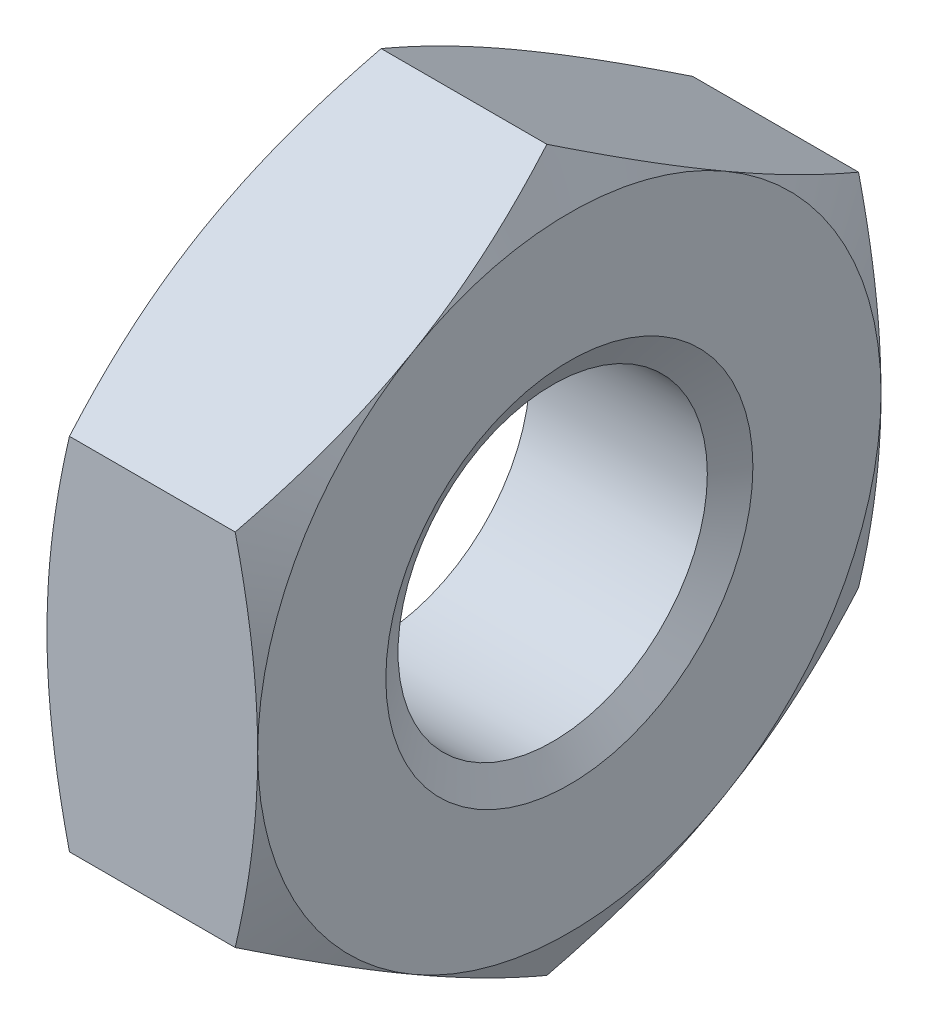
ISO-10303-21;
HEADER;
FILE_DESCRIPTION(('STEP AP214'),'2;1');
FILE_NAME('part.step','',(''),(''),'','','');
FILE_SCHEMA(('AUTOMOTIVE_DESIGN { 1 0 10303 214 1 1 1 1 }'));
ENDSEC;
DATA;
#1=APPLICATION_CONTEXT('core data for automotive mechanical design processes');
#2=APPLICATION_PROTOCOL_DEFINITION('international standard','automotive_design',2000,#1);
#3=PRODUCT_CONTEXT('',#1,'mechanical');
#4=PRODUCT('Part','Part','',(#3));
#5=PRODUCT_RELATED_PRODUCT_CATEGORY('part','',(#4));
#6=PRODUCT_DEFINITION_FORMATION('','',#4);
#7=PRODUCT_DEFINITION_CONTEXT('part definition',#1,'design');
#8=PRODUCT_DEFINITION('design','',#6,#7);
#9=PRODUCT_DEFINITION_SHAPE('','',#8);
#10=(LENGTH_UNIT() NAMED_UNIT(*) SI_UNIT(.MILLI.,.METRE.));
#11=(NAMED_UNIT(*) PLANE_ANGLE_UNIT() SI_UNIT($,.RADIAN.));
#12=(NAMED_UNIT(*) SI_UNIT($,.STERADIAN.) SOLID_ANGLE_UNIT());
#13=UNCERTAINTY_MEASURE_WITH_UNIT(LENGTH_MEASURE(1.E-05),#10,'distance_accuracy_value','');
#14=(GEOMETRIC_REPRESENTATION_CONTEXT(3) GLOBAL_UNCERTAINTY_ASSIGNED_CONTEXT((#13)) GLOBAL_UNIT_ASSIGNED_CONTEXT((#10,
#11,#12)) REPRESENTATION_CONTEXT('',''));
#15=CARTESIAN_POINT('',(0.,0.,0.));
#16=DIRECTION('',(0.,0.,1.));
#17=DIRECTION('',(1.,0.,0.));
#18=AXIS2_PLACEMENT_3D('',#15,#16,#17);
#19=CARTESIAN_POINT('',(0.,-7.78695402066813,-13.4874));
#20=DIRECTION('',(0.,-0.866025403784438,-0.5));
#21=DIRECTION('',(0.,0.5,-0.866025403784438));
#22=AXIS2_PLACEMENT_3D('',#19,#20,#21);
#23=PLANE('',#22);
#24=CARTESIAN_POINT('',(0.,-11.6804310310022,-6.7437));
#25=CARTESIAN_POINT('',(0.,-9.87346206200447,-9.87346206200447));
#26=CARTESIAN_POINT('',(0.972954678477099,-7.78695402066815,-13.4874));
#27=(BOUNDED_CURVE() B_SPLINE_CURVE(2,(#24,#25,#26),.UNSPECIFIED.,.F.,
.F.) B_SPLINE_CURVE_WITH_KNOTS((3,3),(0.786078902186761,1.57215780437352),
.UNSPECIFIED.) CURVE() GEOMETRIC_REPRESENTATION_ITEM() RATIONAL_B_SPLINE_CURVE((1.,
1.03795484930203,1.)) REPRESENTATION_ITEM(''));
#28=CARTESIAN_POINT('',(0.,-11.6804310310022,-6.7437));
#29=VERTEX_POINT('',#28);
#30=CARTESIAN_POINT('',(0.972954678477099,-7.7869540206681,-13.4874));
#31=VERTEX_POINT('',#30);
#32=EDGE_CURVE('E248',#29,#31,#27,.T.);
#33=ORIENTED_EDGE('',*,*,#32,.T.);
#34=DIRECTION('',(1.,0.,0.));
#35=VECTOR('',#34,1.);
#36=CARTESIAN_POINT('',(0.972954678477099,-7.78695402066813,-13.4874));
#37=LINE('',#36,#35);
#38=CARTESIAN_POINT('',(8.1456453215229,-7.7869540206681,-13.4874));
#39=VERTEX_POINT('',#38);
#40=EDGE_CURVE('E11',#31,#39,#37,.T.);
#41=ORIENTED_EDGE('',*,*,#40,.T.);
#42=CARTESIAN_POINT('',(8.1456453215229,-7.78695402066815,-13.4874));
#43=CARTESIAN_POINT('',(9.11859999999999,-9.87346206200445,-9.87346206200451));
#44=CARTESIAN_POINT('',(9.1186,-11.6804310310022,-6.7437));
#45=(BOUNDED_CURVE() B_SPLINE_CURVE(2,(#42,#43,#44),.UNSPECIFIED.,.F.,
.F.) B_SPLINE_CURVE_WITH_KNOTS((3,3),(0.,0.786078902186761),
.UNSPECIFIED.) CURVE() GEOMETRIC_REPRESENTATION_ITEM() RATIONAL_B_SPLINE_CURVE((1.,
1.03795484930204,1.)) REPRESENTATION_ITEM(''));
#46=CARTESIAN_POINT('',(9.1186,-11.6804310310022,-6.7437));
#47=VERTEX_POINT('',#46);
#48=EDGE_CURVE('E154',#39,#47,#45,.T.);
#49=ORIENTED_EDGE('',*,*,#48,.T.);
#50=CARTESIAN_POINT('',(9.1186,-11.6804310310022,-6.7437));
#51=CARTESIAN_POINT('',(9.1186,-13.4874,-3.61393793799552));
#52=CARTESIAN_POINT('',(8.1456453215229,-15.5739080413364,0.));
#53=(BOUNDED_CURVE() B_SPLINE_CURVE(2,(#50,#51,#52),.UNSPECIFIED.,.F.,
.F.) B_SPLINE_CURVE_WITH_KNOTS((3,3),(0.786078902186761,1.57215780437352),
.UNSPECIFIED.) CURVE() GEOMETRIC_REPRESENTATION_ITEM() RATIONAL_B_SPLINE_CURVE((1.,
1.03795484930204,1.)) REPRESENTATION_ITEM(''));
#54=CARTESIAN_POINT('',(8.1456453215229,-15.5739080413364,0.));
#55=VERTEX_POINT('',#54);
#56=EDGE_CURVE('E157',#47,#55,#53,.T.);
#57=ORIENTED_EDGE('',*,*,#56,.T.);
#58=DIRECTION('',(1.,0.,0.));
#59=VECTOR('',#58,1.);
#60=CARTESIAN_POINT('',(0.972954678477099,-15.5739080413364,0.));
#61=LINE('',#60,#59);
#62=CARTESIAN_POINT('',(0.972954678477099,-15.5739080413364,0.));
#63=VERTEX_POINT('',#62);
#64=EDGE_CURVE('E227',#63,#55,#61,.T.);
#65=ORIENTED_EDGE('',*,*,#64,.F.);
#66=CARTESIAN_POINT('',(0.972954678477099,-15.5739080413364,0.));
#67=CARTESIAN_POINT('',(0.,-13.4874,-3.61393793799552));
#68=CARTESIAN_POINT('',(0.,-11.6804310310022,-6.7437));
#69=(BOUNDED_CURVE() B_SPLINE_CURVE(2,(#66,#67,#68),.UNSPECIFIED.,.F.,
.F.) B_SPLINE_CURVE_WITH_KNOTS((3,3),(0.,0.786078902186761),
.UNSPECIFIED.) CURVE() GEOMETRIC_REPRESENTATION_ITEM() RATIONAL_B_SPLINE_CURVE((1.,
1.03795484930204,1.)) REPRESENTATION_ITEM(''));
#70=EDGE_CURVE('E233',#63,#29,#69,.T.);
#71=ORIENTED_EDGE('',*,*,#70,.T.);
#72=EDGE_LOOP('',(#33,#41,#49,#57,#65,#71));
#73=FACE_BOUND('',#72,.T.);
#74=ADVANCED_FACE('F16',(#73),#23,.T.);
#75=CARTESIAN_POINT('',(0.,7.78695402066818,-13.4874));
#76=DIRECTION('',(0.,0.,-1.));
#77=DIRECTION('',(0.,-1.,0.));
#78=AXIS2_PLACEMENT_3D('',#75,#76,#77);
#79=PLANE('',#78);
#80=CARTESIAN_POINT('',(0.,0.,-13.4874));
#81=CARTESIAN_POINT('',(0.,3.61393793799555,-13.4874));
#82=CARTESIAN_POINT('',(0.972954678477099,7.78695402066815,-13.4874));
#83=(BOUNDED_CURVE() B_SPLINE_CURVE(2,(#80,#81,#82),.UNSPECIFIED.,.F.,
.F.) B_SPLINE_CURVE_WITH_KNOTS((3,3),(0.786078902186757,1.57215780437351),
.UNSPECIFIED.) CURVE() GEOMETRIC_REPRESENTATION_ITEM() RATIONAL_B_SPLINE_CURVE((1.,
1.03795484930204,1.)) REPRESENTATION_ITEM(''));
#84=CARTESIAN_POINT('',(0.,0.,-13.4874));
#85=VERTEX_POINT('',#84);
#86=CARTESIAN_POINT('',(0.972954678477099,7.7869540206682,-13.4874));
#87=VERTEX_POINT('',#86);
#88=EDGE_CURVE('E225',#85,#87,#83,.T.);
#89=ORIENTED_EDGE('',*,*,#88,.T.);
#90=DIRECTION('',(1.,0.,0.));
#91=VECTOR('',#90,1.);
#92=CARTESIAN_POINT('',(0.972954678477099,7.78695402066818,-13.4874));
#93=LINE('',#92,#91);
#94=CARTESIAN_POINT('',(8.1456453215229,7.7869540206682,-13.4874));
#95=VERTEX_POINT('',#94);
#96=EDGE_CURVE('E27',#87,#95,#93,.T.);
#97=ORIENTED_EDGE('',*,*,#96,.T.);
#98=CARTESIAN_POINT('',(8.1456453215229,7.78695402066815,-13.4874));
#99=CARTESIAN_POINT('',(9.11860000000001,3.61393793799555,-13.4874));
#100=CARTESIAN_POINT('',(9.1186,0.,-13.4874));
#101=(BOUNDED_CURVE() B_SPLINE_CURVE(2,(#98,#99,#100),.UNSPECIFIED.,.F.,
.F.) B_SPLINE_CURVE_WITH_KNOTS((3,3),(0.,0.786078902186757),
.UNSPECIFIED.) CURVE() GEOMETRIC_REPRESENTATION_ITEM() RATIONAL_B_SPLINE_CURVE((1.,
1.03795484930203,1.)) REPRESENTATION_ITEM(''));
#102=CARTESIAN_POINT('',(9.1186,0.,-13.4874));
#103=VERTEX_POINT('',#102);
#104=EDGE_CURVE('E211',#95,#103,#101,.T.);
#105=ORIENTED_EDGE('',*,*,#104,.T.);
#106=CARTESIAN_POINT('',(9.1186,0.,-13.4874));
#107=CARTESIAN_POINT('',(9.11860000000001,-3.61393793799547,-13.4874));
#108=CARTESIAN_POINT('',(8.1456453215229,-7.7869540206681,-13.4874));
#109=(BOUNDED_CURVE() B_SPLINE_CURVE(2,(#106,#107,#108),.UNSPECIFIED.,.F.,
.F.) B_SPLINE_CURVE_WITH_KNOTS((3,3),(0.786078902186757,1.57215780437351),
.UNSPECIFIED.) CURVE() GEOMETRIC_REPRESENTATION_ITEM() RATIONAL_B_SPLINE_CURVE((1.,
1.03795484930204,1.)) REPRESENTATION_ITEM(''));
#110=EDGE_CURVE('E165',#103,#39,#109,.T.);
#111=ORIENTED_EDGE('',*,*,#110,.T.);
#112=ORIENTED_EDGE('',*,*,#40,.F.);
#113=CARTESIAN_POINT('',(0.972954678477125,-7.7869540206681,-13.4874));
#114=CARTESIAN_POINT('',(0.,-3.61393793799547,-13.4874));
#115=CARTESIAN_POINT('',(0.,0.,-13.4874));
#116=(BOUNDED_CURVE() B_SPLINE_CURVE(2,(#113,#114,#115),.UNSPECIFIED.,.F.,
.F.) B_SPLINE_CURVE_WITH_KNOTS((3,3),(0.,0.786078902186757),
.UNSPECIFIED.) CURVE() GEOMETRIC_REPRESENTATION_ITEM() RATIONAL_B_SPLINE_CURVE((1.,
1.03795484930204,1.)) REPRESENTATION_ITEM(''));
#117=EDGE_CURVE('E239',#31,#85,#116,.T.);
#118=ORIENTED_EDGE('',*,*,#117,.T.);
#119=EDGE_LOOP('',(#89,#97,#105,#111,#112,#118));
#120=FACE_BOUND('',#119,.T.);
#121=ADVANCED_FACE('F419',(#120),#79,.T.);
#122=CARTESIAN_POINT('',(0.,15.5739080413364,0.));
#123=DIRECTION('',(0.,0.866025403784439,-0.5));
#124=DIRECTION('',(-1.,0.,0.));
#125=AXIS2_PLACEMENT_3D('',#122,#123,#124);
#126=PLANE('',#125);
#127=CARTESIAN_POINT('',(0.,11.6804310310023,-6.7437));
#128=CARTESIAN_POINT('',(0.,13.4874,-3.61393793799553));
#129=CARTESIAN_POINT('',(0.972954678477125,15.5739080413364,0.));
#130=(BOUNDED_CURVE() B_SPLINE_CURVE(2,(#127,#128,#129),.UNSPECIFIED.,.F.,
.F.) B_SPLINE_CURVE_WITH_KNOTS((3,3),(0.786078902186758,1.57215780437351),
.UNSPECIFIED.) CURVE() GEOMETRIC_REPRESENTATION_ITEM() RATIONAL_B_SPLINE_CURVE((1.,
1.03795484930204,1.)) REPRESENTATION_ITEM(''));
#131=CARTESIAN_POINT('',(0.,11.6804310310023,-6.7437));
#132=VERTEX_POINT('',#131);
#133=CARTESIAN_POINT('',(0.972954678477099,15.5739080413364,0.));
#134=VERTEX_POINT('',#133);
#135=EDGE_CURVE('E298',#132,#134,#130,.T.);
#136=ORIENTED_EDGE('',*,*,#135,.T.);
#137=DIRECTION('',(1.,0.,0.));
#138=VECTOR('',#137,1.);
#139=CARTESIAN_POINT('',(0.972954678477099,15.5739080413364,0.));
#140=LINE('',#139,#138);
#141=CARTESIAN_POINT('',(8.1456453215229,15.5739080413364,0.));
#142=VERTEX_POINT('',#141);
#143=EDGE_CURVE('E20',#134,#142,#140,.T.);
#144=ORIENTED_EDGE('',*,*,#143,.T.);
#145=CARTESIAN_POINT('',(8.1456453215229,15.5739080413364,0.));
#146=CARTESIAN_POINT('',(9.11859999999999,13.4874,-3.61393793799552));
#147=CARTESIAN_POINT('',(9.1186,11.6804310310023,-6.7437));
#148=(BOUNDED_CURVE() B_SPLINE_CURVE(2,(#145,#146,#147),.UNSPECIFIED.,.F.,
.F.) B_SPLINE_CURVE_WITH_KNOTS((3,3),(0.,0.786078902186758),
.UNSPECIFIED.) CURVE() GEOMETRIC_REPRESENTATION_ITEM() RATIONAL_B_SPLINE_CURVE((1.,
1.03795484930205,1.)) REPRESENTATION_ITEM(''));
#149=CARTESIAN_POINT('',(9.1186,11.6804310310023,-6.7437));
#150=VERTEX_POINT('',#149);
#151=EDGE_CURVE('E287',#142,#150,#148,.T.);
#152=ORIENTED_EDGE('',*,*,#151,.T.);
#153=CARTESIAN_POINT('',(9.1186,11.6804310310023,-6.7437));
#154=CARTESIAN_POINT('',(9.1186,9.87346206200451,-9.87346206200445));
#155=CARTESIAN_POINT('',(8.1456453215229,7.7869540206682,-13.4874));
#156=(BOUNDED_CURVE() B_SPLINE_CURVE(2,(#153,#154,#155),.UNSPECIFIED.,.F.,
.F.) B_SPLINE_CURVE_WITH_KNOTS((3,3),(0.786078902186758,1.57215780437351),
.UNSPECIFIED.) CURVE() GEOMETRIC_REPRESENTATION_ITEM() RATIONAL_B_SPLINE_CURVE((1.,
1.03795484930204,1.)) REPRESENTATION_ITEM(''));
#157=EDGE_CURVE('E206',#150,#95,#156,.T.);
#158=ORIENTED_EDGE('',*,*,#157,.T.);
#159=ORIENTED_EDGE('',*,*,#96,.F.);
#160=CARTESIAN_POINT('',(0.972954678477125,7.7869540206682,-13.4874));
#161=CARTESIAN_POINT('',(0.,9.87346206200451,-9.87346206200449));
#162=CARTESIAN_POINT('',(0.,11.6804310310023,-6.7437));
#163=(BOUNDED_CURVE() B_SPLINE_CURVE(2,(#160,#161,#162),.UNSPECIFIED.,.F.,
.F.) B_SPLINE_CURVE_WITH_KNOTS((3,3),(0.,0.786078902186758),
.UNSPECIFIED.) CURVE() GEOMETRIC_REPRESENTATION_ITEM() RATIONAL_B_SPLINE_CURVE((1.,
1.03795484930204,1.)) REPRESENTATION_ITEM(''));
#164=EDGE_CURVE('E220',#87,#132,#163,.T.);
#165=ORIENTED_EDGE('',*,*,#164,.T.);
#166=EDGE_LOOP('',(#136,#144,#152,#158,#159,#165));
#167=FACE_BOUND('',#166,.T.);
#168=ADVANCED_FACE('F424',(#167),#126,.T.);
#169=CARTESIAN_POINT('',(0.,-15.5739080413364,0.));
#170=DIRECTION('',(0.,-0.866025403784439,0.5));
#171=DIRECTION('',(-1.,0.,0.));
#172=AXIS2_PLACEMENT_3D('',#169,#170,#171);
#173=PLANE('',#172);
#174=CARTESIAN_POINT('',(0.972954678477099,-7.78695402066815,13.4874));
#175=CARTESIAN_POINT('',(0.,-9.87346206200448,9.87346206200448));
#176=CARTESIAN_POINT('',(0.,-11.6804310310022,6.7437));
#177=(BOUNDED_CURVE() B_SPLINE_CURVE(2,(#174,#175,#176),.UNSPECIFIED.,.F.,
.F.) B_SPLINE_CURVE_WITH_KNOTS((3,3),(0.,0.78607890218676),
.UNSPECIFIED.) CURVE() GEOMETRIC_REPRESENTATION_ITEM() RATIONAL_B_SPLINE_CURVE((1.,
1.03795484930205,1.)) REPRESENTATION_ITEM(''));
#178=CARTESIAN_POINT('',(0.972954678477099,-7.78695402066818,13.4874));
#179=VERTEX_POINT('',#178);
#180=CARTESIAN_POINT('',(0.,-11.6804310310022,6.7437));
#181=VERTEX_POINT('',#180);
#182=EDGE_CURVE('E226',#179,#181,#177,.T.);
#183=ORIENTED_EDGE('',*,*,#182,.T.);
#184=CARTESIAN_POINT('',(0.,-11.6804310310022,6.7437));
#185=CARTESIAN_POINT('',(0.,-13.4874,3.61393793799552));
#186=CARTESIAN_POINT('',(0.972954678477099,-15.5739080413364,0.));
#187=(BOUNDED_CURVE() B_SPLINE_CURVE(2,(#184,#185,#186),.UNSPECIFIED.,.F.,
.F.) B_SPLINE_CURVE_WITH_KNOTS((3,3),(0.78607890218676,1.57215780437352),
.UNSPECIFIED.) CURVE() GEOMETRIC_REPRESENTATION_ITEM() RATIONAL_B_SPLINE_CURVE((1.,
1.03795484930204,1.)) REPRESENTATION_ITEM(''));
#188=EDGE_CURVE('E185',#181,#63,#187,.T.);
#189=ORIENTED_EDGE('',*,*,#188,.T.);
#190=ORIENTED_EDGE('',*,*,#64,.T.);
#191=CARTESIAN_POINT('',(8.1456453215229,-15.5739080413364,0.));
#192=CARTESIAN_POINT('',(9.11860000000001,-13.4874,3.61393793799552));
#193=CARTESIAN_POINT('',(9.1186,-11.6804310310022,6.7437));
#194=(BOUNDED_CURVE() B_SPLINE_CURVE(2,(#191,#192,#193),.UNSPECIFIED.,.F.,
.F.) B_SPLINE_CURVE_WITH_KNOTS((3,3),(0.,0.786078902186761),
.UNSPECIFIED.) CURVE() GEOMETRIC_REPRESENTATION_ITEM() RATIONAL_B_SPLINE_CURVE((1.,
1.03795484930203,1.)) REPRESENTATION_ITEM(''));
#195=CARTESIAN_POINT('',(9.1186,-11.6804310310022,6.7437));
#196=VERTEX_POINT('',#195);
#197=EDGE_CURVE('E173',#55,#196,#194,.T.);
#198=ORIENTED_EDGE('',*,*,#197,.T.);
#199=CARTESIAN_POINT('',(9.1186,-11.6804310310022,6.7437));
#200=CARTESIAN_POINT('',(9.1186,-9.87346206200449,9.87346206200449));
#201=CARTESIAN_POINT('',(8.1456453215229,-7.78695402066815,13.4874));
#202=(BOUNDED_CURVE() B_SPLINE_CURVE(2,(#199,#200,#201),.UNSPECIFIED.,.F.,
.F.) B_SPLINE_CURVE_WITH_KNOTS((3,3),(0.786078902186761,1.57215780437352),
.UNSPECIFIED.) CURVE() GEOMETRIC_REPRESENTATION_ITEM() RATIONAL_B_SPLINE_CURVE((1.,
1.03795484930204,1.)) REPRESENTATION_ITEM(''));
#203=CARTESIAN_POINT('',(8.1456453215229,-7.78695402066818,13.4874));
#204=VERTEX_POINT('',#203);
#205=EDGE_CURVE('E258',#196,#204,#202,.T.);
#206=ORIENTED_EDGE('',*,*,#205,.T.);
#207=DIRECTION('',(1.,0.,0.));
#208=VECTOR('',#207,1.);
#209=CARTESIAN_POINT('',(0.972954678477099,-7.78695402066815,13.4874));
#210=LINE('',#209,#208);
#211=EDGE_CURVE('E125',#179,#204,#210,.T.);
#212=ORIENTED_EDGE('',*,*,#211,.F.);
#213=EDGE_LOOP('',(#183,#189,#190,#198,#206,#212));
#214=FACE_BOUND('',#213,.T.);
#215=ADVANCED_FACE('F442',(#214),#173,.T.);
#216=CARTESIAN_POINT('',(0.,-7.78695402066815,13.4874));
#217=DIRECTION('',(0.,0.,1.));
#218=DIRECTION('',(1.,0.,0.));
#219=AXIS2_PLACEMENT_3D('',#216,#217,#218);
#220=PLANE('',#219);
#221=CARTESIAN_POINT('',(0.972954678477099,7.78695402066818,13.4874));
#222=CARTESIAN_POINT('',(0.,3.61393793799552,13.4874));
#223=CARTESIAN_POINT('',(0.,0.,13.4874));
#224=(BOUNDED_CURVE() B_SPLINE_CURVE(2,(#221,#222,#223),.UNSPECIFIED.,.F.,
.F.) B_SPLINE_CURVE_WITH_KNOTS((3,3),(0.,0.786078902186761),
.UNSPECIFIED.) CURVE() GEOMETRIC_REPRESENTATION_ITEM() RATIONAL_B_SPLINE_CURVE((1.,
1.03795484930205,1.)) REPRESENTATION_ITEM(''));
#225=CARTESIAN_POINT('',(0.972954678477099,7.78695402066818,13.4874));
#226=VERTEX_POINT('',#225);
#227=CARTESIAN_POINT('',(0.,0.,13.4874));
#228=VERTEX_POINT('',#227);
#229=EDGE_CURVE('E303',#226,#228,#224,.T.);
#230=ORIENTED_EDGE('',*,*,#229,.T.);
#231=CARTESIAN_POINT('',(0.,0.,13.4874));
#232=CARTESIAN_POINT('',(0.,-3.61393793799552,13.4874));
#233=CARTESIAN_POINT('',(0.972954678477099,-7.78695402066818,13.4874));
#234=(BOUNDED_CURVE() B_SPLINE_CURVE(2,(#231,#232,#233),.UNSPECIFIED.,.F.,
.F.) B_SPLINE_CURVE_WITH_KNOTS((3,3),(0.786078902186761,1.57215780437352),
.UNSPECIFIED.) CURVE() GEOMETRIC_REPRESENTATION_ITEM() RATIONAL_B_SPLINE_CURVE((1.,
1.03795484930205,1.)) REPRESENTATION_ITEM(''));
#235=EDGE_CURVE('E267',#228,#179,#234,.T.);
#236=ORIENTED_EDGE('',*,*,#235,.T.);
#237=ORIENTED_EDGE('',*,*,#211,.T.);
#238=CARTESIAN_POINT('',(8.1456453215229,-7.78695402066818,13.4874));
#239=CARTESIAN_POINT('',(9.11860000000001,-3.61393793799557,13.4874));
#240=CARTESIAN_POINT('',(9.1186,0.,13.4874));
#241=(BOUNDED_CURVE() B_SPLINE_CURVE(2,(#238,#239,#240),.UNSPECIFIED.,.F.,
.F.) B_SPLINE_CURVE_WITH_KNOTS((3,3),(0.,0.786078902186762),
.UNSPECIFIED.) CURVE() GEOMETRIC_REPRESENTATION_ITEM() RATIONAL_B_SPLINE_CURVE((1.,
1.03795484930205,1.)) REPRESENTATION_ITEM(''));
#242=CARTESIAN_POINT('',(9.1186,0.,13.4874));
#243=VERTEX_POINT('',#242);
#244=EDGE_CURVE('E164',#204,#243,#241,.T.);
#245=ORIENTED_EDGE('',*,*,#244,.T.);
#246=CARTESIAN_POINT('',(9.1186,0.,13.4874));
#247=CARTESIAN_POINT('',(9.11860000000001,3.61393793799557,13.4874));
#248=CARTESIAN_POINT('',(8.1456453215229,7.78695402066818,13.4874));
#249=(BOUNDED_CURVE() B_SPLINE_CURVE(2,(#246,#247,#248),.UNSPECIFIED.,.F.,
.F.) B_SPLINE_CURVE_WITH_KNOTS((3,3),(0.786078902186762,1.57215780437352),
.UNSPECIFIED.) CURVE() GEOMETRIC_REPRESENTATION_ITEM() RATIONAL_B_SPLINE_CURVE((1.,
1.03795484930205,1.)) REPRESENTATION_ITEM(''));
#250=CARTESIAN_POINT('',(8.1456453215229,7.78695402066818,13.4874));
#251=VERTEX_POINT('',#250);
#252=EDGE_CURVE('E212',#243,#251,#249,.T.);
#253=ORIENTED_EDGE('',*,*,#252,.T.);
#254=DIRECTION('',(1.,0.,0.));
#255=VECTOR('',#254,1.);
#256=CARTESIAN_POINT('',(0.972954678477099,7.78695402066815,13.4874));
#257=LINE('',#256,#255);
#258=EDGE_CURVE('E350',#226,#251,#257,.T.);
#259=ORIENTED_EDGE('',*,*,#258,.F.);
#260=EDGE_LOOP('',(#230,#236,#237,#245,#253,#259));
#261=FACE_BOUND('',#260,.T.);
#262=ADVANCED_FACE('F439',(#261),#220,.T.);
#263=CARTESIAN_POINT('',(0.,7.78695402066815,13.4874));
#264=DIRECTION('',(0.,0.866025403784438,0.5));
#265=DIRECTION('',(1.,0.,0.));
#266=AXIS2_PLACEMENT_3D('',#263,#264,#265);
#267=PLANE('',#266);
#268=CARTESIAN_POINT('',(0.972954678477099,15.5739080413364,0.));
#269=CARTESIAN_POINT('',(0.,13.4874,3.61393793799555));
#270=CARTESIAN_POINT('',(0.,11.6804310310022,6.7437));
#271=(BOUNDED_CURVE() B_SPLINE_CURVE(2,(#268,#269,#270),.UNSPECIFIED.,.F.,
.F.) B_SPLINE_CURVE_WITH_KNOTS((3,3),(0.,0.78607890218676),
.UNSPECIFIED.) CURVE() GEOMETRIC_REPRESENTATION_ITEM() RATIONAL_B_SPLINE_CURVE((1.,
1.03795484930204,1.)) REPRESENTATION_ITEM(''));
#272=CARTESIAN_POINT('',(0.,11.6804310310022,6.7437));
#273=VERTEX_POINT('',#272);
#274=EDGE_CURVE('E302',#134,#273,#271,.T.);
#275=ORIENTED_EDGE('',*,*,#274,.T.);
#276=CARTESIAN_POINT('',(0.,11.6804310310022,6.7437));
#277=CARTESIAN_POINT('',(0.,9.87346206200447,9.87346206200447));
#278=CARTESIAN_POINT('',(0.972954678477099,7.78695402066815,13.4874));
#279=(BOUNDED_CURVE() B_SPLINE_CURVE(2,(#276,#277,#278),.UNSPECIFIED.,.F.,
.F.) B_SPLINE_CURVE_WITH_KNOTS((3,3),(0.78607890218676,1.57215780437352),
.UNSPECIFIED.) CURVE() GEOMETRIC_REPRESENTATION_ITEM() RATIONAL_B_SPLINE_CURVE((1.,
1.03795484930204,1.)) REPRESENTATION_ITEM(''));
#280=EDGE_CURVE('E334',#273,#226,#279,.T.);
#281=ORIENTED_EDGE('',*,*,#280,.T.);
#282=ORIENTED_EDGE('',*,*,#258,.T.);
#283=CARTESIAN_POINT('',(8.1456453215229,7.78695402066815,13.4874));
#284=CARTESIAN_POINT('',(9.11860000000001,9.87346206200445,9.87346206200451));
#285=CARTESIAN_POINT('',(9.1186,11.6804310310022,6.7437));
#286=(BOUNDED_CURVE() B_SPLINE_CURVE(2,(#283,#284,#285),.UNSPECIFIED.,.F.,
.F.) B_SPLINE_CURVE_WITH_KNOTS((3,3),(0.,0.786078902186761),
.UNSPECIFIED.) CURVE() GEOMETRIC_REPRESENTATION_ITEM() RATIONAL_B_SPLINE_CURVE((1.,
1.03795484930205,1.)) REPRESENTATION_ITEM(''));
#287=CARTESIAN_POINT('',(9.1186,11.6804310310022,6.7437));
#288=VERTEX_POINT('',#287);
#289=EDGE_CURVE('E249',#251,#288,#286,.T.);
#290=ORIENTED_EDGE('',*,*,#289,.T.);
#291=CARTESIAN_POINT('',(9.1186,11.6804310310022,6.7437));
#292=CARTESIAN_POINT('',(9.1186,13.4874,3.61393793799552));
#293=CARTESIAN_POINT('',(8.1456453215229,15.5739080413364,0.));
#294=(BOUNDED_CURVE() B_SPLINE_CURVE(2,(#291,#292,#293),.UNSPECIFIED.,.F.,
.F.) B_SPLINE_CURVE_WITH_KNOTS((3,3),(0.786078902186761,1.57215780437352),
.UNSPECIFIED.) CURVE() GEOMETRIC_REPRESENTATION_ITEM() RATIONAL_B_SPLINE_CURVE((1.,
1.03795484930204,1.)) REPRESENTATION_ITEM(''));
#295=EDGE_CURVE('E282',#288,#142,#294,.T.);
#296=ORIENTED_EDGE('',*,*,#295,.T.);
#297=ORIENTED_EDGE('',*,*,#143,.F.);
#298=EDGE_LOOP('',(#275,#281,#282,#290,#296,#297));
#299=FACE_BOUND('',#298,.T.);
#300=ADVANCED_FACE('F428',(#299),#267,.T.);
#301=CARTESIAN_POINT('',(8.63212266076145,0.,0.));
#302=DIRECTION('',(-1.,0.,0.));
#303=DIRECTION('',(0.,1.,0.));
#304=AXIS2_PLACEMENT_3D('',#301,#302,#303);
#305=CONICAL_SURFACE('',#304,14.5306540206682,1.1344640125);
#306=ORIENTED_EDGE('',*,*,#295,.F.);
#307=CARTESIAN_POINT('',(9.1186,0.,0.));
#308=DIRECTION('',(1.,0.,0.));
#309=DIRECTION('',(0.,1.,0.));
#310=AXIS2_PLACEMENT_3D('',#307,#308,#309);
#311=CIRCLE('',#310,13.4874);
#312=EDGE_CURVE('E198',#150,#288,#311,.T.);
#313=ORIENTED_EDGE('',*,*,#312,.F.);
#314=ORIENTED_EDGE('',*,*,#151,.F.);
#315=EDGE_LOOP('',(#306,#313,#314));
#316=FACE_BOUND('',#315,.T.);
#317=ADVANCED_FACE('F426',(#316),#305,.T.);
#318=CARTESIAN_POINT('',(8.63212266076145,0.,0.));
#319=DIRECTION('',(-1.,0.,0.));
#320=DIRECTION('',(0.,1.,0.));
#321=AXIS2_PLACEMENT_3D('',#318,#319,#320);
#322=CONICAL_SURFACE('',#321,14.5306540206682,1.1344640125);
#323=ORIENTED_EDGE('',*,*,#157,.F.);
#324=CARTESIAN_POINT('',(9.1186,0.,0.));
#325=DIRECTION('',(1.,0.,0.));
#326=DIRECTION('',(0.,1.,0.));
#327=AXIS2_PLACEMENT_3D('',#324,#325,#326);
#328=CIRCLE('',#327,13.4874);
#329=EDGE_CURVE('E190',#103,#150,#328,.T.);
#330=ORIENTED_EDGE('',*,*,#329,.F.);
#331=ORIENTED_EDGE('',*,*,#104,.F.);
#332=EDGE_LOOP('',(#323,#330,#331));
#333=FACE_BOUND('',#332,.T.);
#334=ADVANCED_FACE('F422',(#333),#322,.T.);
#335=CARTESIAN_POINT('',(8.63212266076145,0.,0.));
#336=DIRECTION('',(-1.,0.,0.));
#337=DIRECTION('',(0.,1.,0.));
#338=AXIS2_PLACEMENT_3D('',#335,#336,#337);
#339=CONICAL_SURFACE('',#338,14.5306540206682,1.1344640125);
#340=ORIENTED_EDGE('',*,*,#289,.F.);
#341=ORIENTED_EDGE('',*,*,#252,.F.);
#342=CARTESIAN_POINT('',(9.1186,0.,0.));
#343=DIRECTION('',(1.,0.,0.));
#344=DIRECTION('',(0.,1.,0.));
#345=AXIS2_PLACEMENT_3D('',#342,#343,#344);
#346=CIRCLE('',#345,13.4874);
#347=EDGE_CURVE('E357',#288,#243,#346,.T.);
#348=ORIENTED_EDGE('',*,*,#347,.F.);
#349=EDGE_LOOP('',(#340,#341,#348));
#350=FACE_BOUND('',#349,.T.);
#351=ADVANCED_FACE('F434',(#350),#339,.T.);
#352=CARTESIAN_POINT('',(8.63212266076145,0.,0.));
#353=DIRECTION('',(-1.,0.,0.));
#354=DIRECTION('',(0.,1.,0.));
#355=AXIS2_PLACEMENT_3D('',#352,#353,#354);
#356=CONICAL_SURFACE('',#355,14.5306540206682,1.1344640125);
#357=ORIENTED_EDGE('',*,*,#244,.F.);
#358=ORIENTED_EDGE('',*,*,#205,.F.);
#359=CARTESIAN_POINT('',(9.1186,0.,0.));
#360=DIRECTION('',(1.,0.,0.));
#361=DIRECTION('',(0.,1.,0.));
#362=AXIS2_PLACEMENT_3D('',#359,#360,#361);
#363=CIRCLE('',#362,13.4874);
#364=EDGE_CURVE('E183',#243,#196,#363,.T.);
#365=ORIENTED_EDGE('',*,*,#364,.F.);
#366=EDGE_LOOP('',(#357,#358,#365));
#367=FACE_BOUND('',#366,.T.);
#368=ADVANCED_FACE('F441',(#367),#356,.T.);
#369=CARTESIAN_POINT('',(8.63212266076145,0.,0.));
#370=DIRECTION('',(-1.,0.,0.));
#371=DIRECTION('',(0.,1.,0.));
#372=AXIS2_PLACEMENT_3D('',#369,#370,#371);
#373=CONICAL_SURFACE('',#372,14.5306540206682,1.1344640125);
#374=ORIENTED_EDGE('',*,*,#110,.F.);
#375=CARTESIAN_POINT('',(9.1186,0.,0.));
#376=DIRECTION('',(1.,0.,0.));
#377=DIRECTION('',(0.,1.,0.));
#378=AXIS2_PLACEMENT_3D('',#375,#376,#377);
#379=CIRCLE('',#378,13.4874);
#380=EDGE_CURVE('E180',#47,#103,#379,.T.);
#381=ORIENTED_EDGE('',*,*,#380,.F.);
#382=ORIENTED_EDGE('',*,*,#48,.F.);
#383=EDGE_LOOP('',(#374,#381,#382));
#384=FACE_BOUND('',#383,.T.);
#385=ADVANCED_FACE('F187',(#384),#373,.T.);
#386=CARTESIAN_POINT('',(8.63212266076145,0.,0.));
#387=DIRECTION('',(-1.,0.,0.));
#388=DIRECTION('',(0.,1.,0.));
#389=AXIS2_PLACEMENT_3D('',#386,#387,#388);
#390=CONICAL_SURFACE('',#389,14.5306540206682,1.1344640125);
#391=ORIENTED_EDGE('',*,*,#197,.F.);
#392=ORIENTED_EDGE('',*,*,#56,.F.);
#393=CARTESIAN_POINT('',(9.1186,0.,0.));
#394=DIRECTION('',(1.,0.,0.));
#395=DIRECTION('',(0.,1.,0.));
#396=AXIS2_PLACEMENT_3D('',#393,#394,#395);
#397=CIRCLE('',#396,13.4874);
#398=EDGE_CURVE('E170',#196,#47,#397,.T.);
#399=ORIENTED_EDGE('',*,*,#398,.F.);
#400=EDGE_LOOP('',(#391,#392,#399));
#401=FACE_BOUND('',#400,.T.);
#402=ADVANCED_FACE('F18',(#401),#390,.T.);
#403=CARTESIAN_POINT('',(0.48647733923855,0.,0.));
#404=DIRECTION('',(1.,0.,0.));
#405=DIRECTION('',(0.,1.,0.));
#406=AXIS2_PLACEMENT_3D('',#403,#404,#405);
#407=CONICAL_SURFACE('',#406,14.5306540206682,1.1344640125);
#408=ORIENTED_EDGE('',*,*,#135,.F.);
#409=CARTESIAN_POINT('',(0.,0.,0.));
#410=DIRECTION('',(-1.,0.,0.));
#411=DIRECTION('',(0.,1.,0.));
#412=AXIS2_PLACEMENT_3D('',#409,#410,#411);
#413=CIRCLE('',#412,13.4874);
#414=EDGE_CURVE('E277',#273,#132,#413,.T.);
#415=ORIENTED_EDGE('',*,*,#414,.F.);
#416=ORIENTED_EDGE('',*,*,#274,.F.);
#417=EDGE_LOOP('',(#408,#415,#416));
#418=FACE_BOUND('',#417,.T.);
#419=ADVANCED_FACE('F461',(#418),#407,.T.);
#420=CARTESIAN_POINT('',(0.48647733923855,0.,0.));
#421=DIRECTION('',(1.,0.,0.));
#422=DIRECTION('',(0.,1.,0.));
#423=AXIS2_PLACEMENT_3D('',#420,#421,#422);
#424=CONICAL_SURFACE('',#423,14.5306540206682,1.1344640125);
#425=ORIENTED_EDGE('',*,*,#280,.F.);
#426=CARTESIAN_POINT('',(0.,0.,0.));
#427=DIRECTION('',(-1.,0.,0.));
#428=DIRECTION('',(0.,1.,0.));
#429=AXIS2_PLACEMENT_3D('',#426,#427,#428);
#430=CIRCLE('',#429,13.4874);
#431=EDGE_CURVE('E281',#228,#273,#430,.T.);
#432=ORIENTED_EDGE('',*,*,#431,.F.);
#433=ORIENTED_EDGE('',*,*,#229,.F.);
#434=EDGE_LOOP('',(#425,#432,#433));
#435=FACE_BOUND('',#434,.T.);
#436=ADVANCED_FACE('F456',(#435),#424,.T.);
#437=CARTESIAN_POINT('',(0.48647733923855,0.,0.));
#438=DIRECTION('',(1.,0.,0.));
#439=DIRECTION('',(0.,1.,0.));
#440=AXIS2_PLACEMENT_3D('',#437,#438,#439);
#441=CONICAL_SURFACE('',#440,14.5306540206682,1.1344640125);
#442=ORIENTED_EDGE('',*,*,#164,.F.);
#443=ORIENTED_EDGE('',*,*,#88,.F.);
#444=CARTESIAN_POINT('',(0.,0.,0.));
#445=DIRECTION('',(-1.,0.,0.));
#446=DIRECTION('',(0.,1.,0.));
#447=AXIS2_PLACEMENT_3D('',#444,#445,#446);
#448=CIRCLE('',#447,13.4874);
#449=EDGE_CURVE('E219',#132,#85,#448,.T.);
#450=ORIENTED_EDGE('',*,*,#449,.F.);
#451=EDGE_LOOP('',(#442,#443,#450));
#452=FACE_BOUND('',#451,.T.);
#453=ADVANCED_FACE('F464',(#452),#441,.T.);
#454=CARTESIAN_POINT('',(0.48647733923855,0.,0.));
#455=DIRECTION('',(1.,0.,0.));
#456=DIRECTION('',(0.,1.,0.));
#457=AXIS2_PLACEMENT_3D('',#454,#455,#456);
#458=CONICAL_SURFACE('',#457,14.5306540206682,1.1344640125);
#459=ORIENTED_EDGE('',*,*,#235,.F.);
#460=CARTESIAN_POINT('',(0.,0.,0.));
#461=DIRECTION('',(-1.,0.,0.));
#462=DIRECTION('',(0.,1.,0.));
#463=AXIS2_PLACEMENT_3D('',#460,#461,#462);
#464=CIRCLE('',#463,13.4874);
#465=EDGE_CURVE('E309',#181,#228,#464,.T.);
#466=ORIENTED_EDGE('',*,*,#465,.F.);
#467=ORIENTED_EDGE('',*,*,#182,.F.);
#468=EDGE_LOOP('',(#459,#466,#467));
#469=FACE_BOUND('',#468,.T.);
#470=ADVANCED_FACE('F451',(#469),#458,.T.);
#471=CARTESIAN_POINT('',(0.48647733923855,0.,0.));
#472=DIRECTION('',(1.,0.,0.));
#473=DIRECTION('',(0.,1.,0.));
#474=AXIS2_PLACEMENT_3D('',#471,#472,#473);
#475=CONICAL_SURFACE('',#474,14.5306540206682,1.1344640125);
#476=ORIENTED_EDGE('',*,*,#117,.F.);
#477=ORIENTED_EDGE('',*,*,#32,.F.);
#478=CARTESIAN_POINT('',(0.,0.,0.));
#479=DIRECTION('',(-1.,0.,0.));
#480=DIRECTION('',(0.,1.,0.));
#481=AXIS2_PLACEMENT_3D('',#478,#479,#480);
#482=CIRCLE('',#481,13.4874);
#483=EDGE_CURVE('E200',#85,#29,#482,.T.);
#484=ORIENTED_EDGE('',*,*,#483,.F.);
#485=EDGE_LOOP('',(#476,#477,#484));
#486=FACE_BOUND('',#485,.T.);
#487=ADVANCED_FACE('F470',(#486),#475,.T.);
#488=CARTESIAN_POINT('',(0.48647733923855,0.,0.));
#489=DIRECTION('',(1.,0.,0.));
#490=DIRECTION('',(0.,1.,0.));
#491=AXIS2_PLACEMENT_3D('',#488,#489,#490);
#492=CONICAL_SURFACE('',#491,14.5306540206682,1.1344640125);
#493=ORIENTED_EDGE('',*,*,#188,.F.);
#494=CARTESIAN_POINT('',(0.,0.,0.));
#495=DIRECTION('',(-1.,0.,0.));
#496=DIRECTION('',(0.,1.,0.));
#497=AXIS2_PLACEMENT_3D('',#494,#495,#496);
#498=CIRCLE('',#497,13.4874);
#499=EDGE_CURVE('E275',#29,#181,#498,.T.);
#500=ORIENTED_EDGE('',*,*,#499,.F.);
#501=ORIENTED_EDGE('',*,*,#70,.F.);
#502=EDGE_LOOP('',(#493,#500,#501));
#503=FACE_BOUND('',#502,.T.);
#504=ADVANCED_FACE('F447',(#503),#492,.T.);
#505=CARTESIAN_POINT('',(9.1186,0.,0.));
#506=DIRECTION('',(1.,0.,0.));
#507=DIRECTION('',(0.,1.,0.));
#508=AXIS2_PLACEMENT_3D('',#505,#506,#507);
#509=PLANE('',#508);
#510=CARTESIAN_POINT('',(9.1186,0.,0.));
#511=DIRECTION('',(1.,0.,0.));
#512=DIRECTION('',(0.,0.,1.));
#513=AXIS2_PLACEMENT_3D('',#510,#511,#512);
#514=CIRCLE('',#513,7.94273211682528);
#515=CARTESIAN_POINT('',(9.1186,0.,-7.94273211682528));
#516=VERTEX_POINT('',#515);
#517=EDGE_CURVE('E191',#516,#516,#514,.T.);
#518=ORIENTED_EDGE('',*,*,#517,.F.);
#519=EDGE_LOOP('',(#518));
#520=FACE_BOUND('',#519,.T.);
#521=ORIENTED_EDGE('',*,*,#380,.T.);
#522=ORIENTED_EDGE('',*,*,#329,.T.);
#523=ORIENTED_EDGE('',*,*,#312,.T.);
#524=ORIENTED_EDGE('',*,*,#347,.T.);
#525=ORIENTED_EDGE('',*,*,#364,.T.);
#526=ORIENTED_EDGE('',*,*,#398,.T.);
#527=EDGE_LOOP('',(#521,#522,#523,#524,#525,#526));
#528=FACE_BOUND('',#527,.T.);
#529=ADVANCED_FACE('F178',(#520,#528),#509,.T.);
#530=CARTESIAN_POINT('',(8.75780454545456,0.,0.));
#531=DIRECTION('',(1.,0.,0.));
#532=DIRECTION('',(0.,0.,1.));
#533=AXIS2_PLACEMENT_3D('',#530,#531,#532);
#534=CONICAL_SURFACE('',#533,7.31781605841263,1.04719755);
#535=ORIENTED_EDGE('',*,*,#517,.T.);
#536=EDGE_LOOP('',(#535));
#537=FACE_BOUND('',#536,.T.);
#538=CARTESIAN_POINT('',(8.39700909090909,0.,0.));
#539=DIRECTION('',(-1.,0.,0.));
#540=DIRECTION('',(0.,0.,1.));
#541=AXIS2_PLACEMENT_3D('',#538,#539,#540);
#542=CIRCLE('',#541,6.6929);
#543=CARTESIAN_POINT('',(8.39700909090909,0.,-6.6929));
#544=VERTEX_POINT('',#543);
#545=EDGE_CURVE('E272',#544,#544,#542,.T.);
#546=ORIENTED_EDGE('',*,*,#545,.T.);
#547=EDGE_LOOP('',(#546));
#548=FACE_BOUND('',#547,.T.);
#549=ADVANCED_FACE('F505',(#537,#548),#534,.F.);
#550=CARTESIAN_POINT('',(0.,0.,0.));
#551=DIRECTION('',(1.,0.,0.));
#552=DIRECTION('',(0.,1.,0.));
#553=AXIS2_PLACEMENT_3D('',#550,#551,#552);
#554=PLANE('',#553);
#555=CARTESIAN_POINT('',(0.,0.,0.));
#556=DIRECTION('',(-1.,0.,0.));
#557=DIRECTION('',(0.,0.,-1.));
#558=AXIS2_PLACEMENT_3D('',#555,#556,#557);
#559=CIRCLE('',#558,7.94273211682528);
#560=CARTESIAN_POINT('',(0.,0.,7.94273211682528));
#561=VERTEX_POINT('',#560);
#562=EDGE_CURVE('E276',#561,#561,#559,.T.);
#563=ORIENTED_EDGE('',*,*,#562,.F.);
#564=EDGE_LOOP('',(#563));
#565=FACE_BOUND('',#564,.T.);
#566=ORIENTED_EDGE('',*,*,#499,.T.);
#567=ORIENTED_EDGE('',*,*,#465,.T.);
#568=ORIENTED_EDGE('',*,*,#431,.T.);
#569=ORIENTED_EDGE('',*,*,#414,.T.);
#570=ORIENTED_EDGE('',*,*,#449,.T.);
#571=ORIENTED_EDGE('',*,*,#483,.T.);
#572=EDGE_LOOP('',(#566,#567,#568,#569,#570,#571));
#573=FACE_BOUND('',#572,.T.);
#574=ADVANCED_FACE('F458',(#565,#573),#554,.F.);
#575=CARTESIAN_POINT('',(-33.0830012459244,0.,0.));
#576=DIRECTION('',(1.,0.,0.));
#577=DIRECTION('',(0.,0.,-1.));
#578=AXIS2_PLACEMENT_3D('',#575,#576,#577);
#579=CYLINDRICAL_SURFACE('',#578,6.6929);
#580=CARTESIAN_POINT('',(0.721590909090912,0.,0.));
#581=DIRECTION('',(1.,0.,0.));
#582=DIRECTION('',(0.,0.,-1.));
#583=AXIS2_PLACEMENT_3D('',#580,#581,#582);
#584=CIRCLE('',#583,6.6929);
#585=CARTESIAN_POINT('',(0.721590909090912,0.,6.6929));
#586=VERTEX_POINT('',#585);
#587=EDGE_CURVE('E295',#586,#586,#584,.T.);
#588=ORIENTED_EDGE('',*,*,#587,.F.);
#589=EDGE_LOOP('',(#588));
#590=FACE_BOUND('',#589,.T.);
#591=ORIENTED_EDGE('',*,*,#545,.F.);
#592=EDGE_LOOP('',(#591));
#593=FACE_BOUND('',#592,.T.);
#594=ADVANCED_FACE('F492',(#590,#593),#579,.F.);
#595=CARTESIAN_POINT('',(0.360795454545443,0.,0.));
#596=DIRECTION('',(-1.,0.,0.));
#597=DIRECTION('',(0.,0.,-1.));
#598=AXIS2_PLACEMENT_3D('',#595,#596,#597);
#599=CONICAL_SURFACE('',#598,7.31781605841263,1.04719755);
#600=ORIENTED_EDGE('',*,*,#562,.T.);
#601=EDGE_LOOP('',(#600));
#602=FACE_BOUND('',#601,.T.);
#603=ORIENTED_EDGE('',*,*,#587,.T.);
#604=EDGE_LOOP('',(#603));
#605=FACE_BOUND('',#604,.T.);
#606=ADVANCED_FACE('F490',(#602,#605),#599,.F.);
#607=CLOSED_SHELL('',(#74,#121,#168,#215,#262,#300,#317,#334,#351,#368,#385,#402,#419,#436,#453,
#470,#487,#504,#529,#549,#574,#594,#606));
#608=MANIFOLD_SOLID_BREP('B1',#607);
#609=ADVANCED_BREP_SHAPE_REPRESENTATION('',(#18,#608),#14);
#610=SHAPE_DEFINITION_REPRESENTATION(#9,#609);
ENDSEC;
END-ISO-10303-21;
